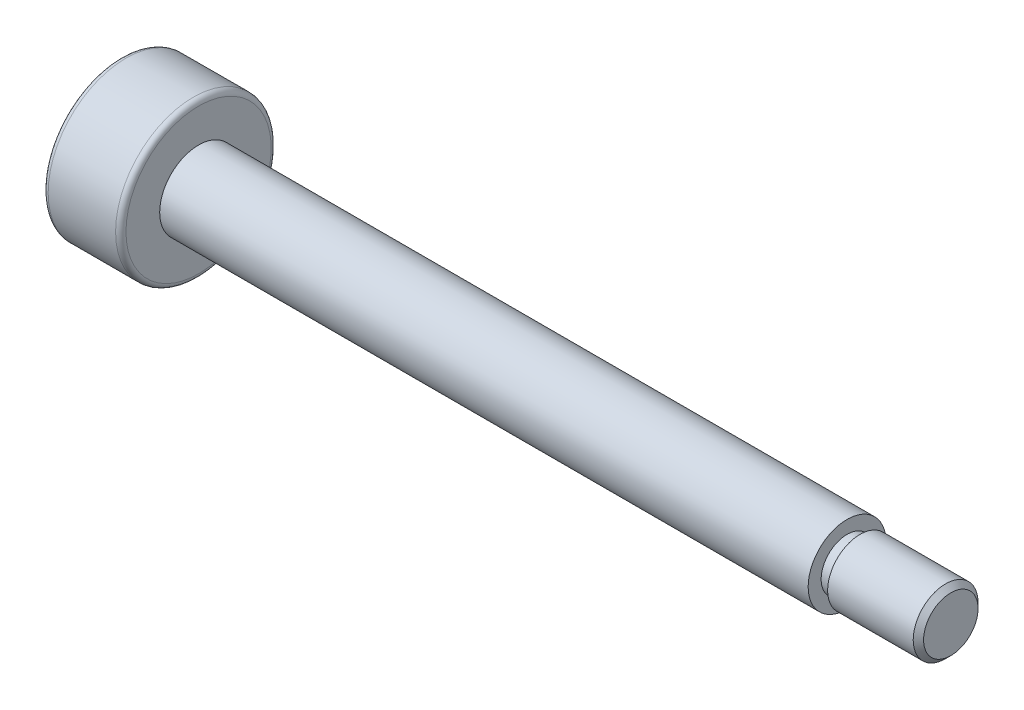
ISO-10303-21;
HEADER;
FILE_DESCRIPTION(('STEP AP214'),'2;1');
FILE_NAME('part.step','',(''),(''),'','','');
FILE_SCHEMA(('AUTOMOTIVE_DESIGN { 1 0 10303 214 1 1 1 1 }'));
ENDSEC;
DATA;
#1=APPLICATION_CONTEXT('core data for automotive mechanical design processes');
#2=APPLICATION_PROTOCOL_DEFINITION('international standard','automotive_design',2000,#1);
#3=PRODUCT_CONTEXT('',#1,'mechanical');
#4=PRODUCT('Part','Part','',(#3));
#5=PRODUCT_RELATED_PRODUCT_CATEGORY('part','',(#4));
#6=PRODUCT_DEFINITION_FORMATION('','',#4);
#7=PRODUCT_DEFINITION_CONTEXT('part definition',#1,'design');
#8=PRODUCT_DEFINITION('design','',#6,#7);
#9=PRODUCT_DEFINITION_SHAPE('','',#8);
#10=(LENGTH_UNIT() NAMED_UNIT(*) SI_UNIT(.MILLI.,.METRE.));
#11=(NAMED_UNIT(*) PLANE_ANGLE_UNIT() SI_UNIT($,.RADIAN.));
#12=(NAMED_UNIT(*) SI_UNIT($,.STERADIAN.) SOLID_ANGLE_UNIT());
#13=UNCERTAINTY_MEASURE_WITH_UNIT(LENGTH_MEASURE(1.E-05),#10,'distance_accuracy_value','');
#14=(GEOMETRIC_REPRESENTATION_CONTEXT(3) GLOBAL_UNCERTAINTY_ASSIGNED_CONTEXT((#13)) GLOBAL_UNIT_ASSIGNED_CONTEXT((#10,
#11,#12)) REPRESENTATION_CONTEXT('',''));
#15=CARTESIAN_POINT('',(0.,0.,0.));
#16=DIRECTION('',(0.,0.,1.));
#17=DIRECTION('',(1.,0.,0.));
#18=AXIS2_PLACEMENT_3D('',#15,#16,#17);
#19=CARTESIAN_POINT('',(-16.,0.,0.));
#20=DIRECTION('',(1.,0.,0.));
#21=DIRECTION('',(0.,0.,-1.));
#22=AXIS2_PLACEMENT_3D('',#19,#20,#21);
#23=PLANE('',#22);
#24=DIRECTION('',(0.,0.866025403784438,-0.5));
#25=VECTOR('',#24,1.);
#26=CARTESIAN_POINT('',(-16.,0.,1.73205080756888));
#27=LINE('',#26,#25);
#28=CARTESIAN_POINT('',(-16.,0.,1.73205080756888));
#29=VERTEX_POINT('',#28);
#30=CARTESIAN_POINT('',(-16.,1.5,0.866025403784438));
#31=VERTEX_POINT('',#30);
#32=EDGE_CURVE('E125',#29,#31,#27,.T.);
#33=ORIENTED_EDGE('',*,*,#32,.F.);
#34=DIRECTION('',(0.,0.866025403784439,0.5));
#35=VECTOR('',#34,1.);
#36=CARTESIAN_POINT('',(-16.,-1.5,0.866025403784438));
#37=LINE('',#36,#35);
#38=CARTESIAN_POINT('',(-16.,-1.5,0.866025403784438));
#39=VERTEX_POINT('',#38);
#40=EDGE_CURVE('E51',#39,#29,#37,.T.);
#41=ORIENTED_EDGE('',*,*,#40,.F.);
#42=DIRECTION('',(0.,0.,1.));
#43=VECTOR('',#42,1.);
#44=CARTESIAN_POINT('',(-16.,-1.5,-0.866025403784438));
#45=LINE('',#44,#43);
#46=CARTESIAN_POINT('',(-16.,-1.5,-0.866025403784438));
#47=VERTEX_POINT('',#46);
#48=EDGE_CURVE('E134',#47,#39,#45,.T.);
#49=ORIENTED_EDGE('',*,*,#48,.F.);
#50=DIRECTION('',(0.,-0.866025403784438,0.5));
#51=VECTOR('',#50,1.);
#52=CARTESIAN_POINT('',(-16.,0.,-1.73205080756888));
#53=LINE('',#52,#51);
#54=CARTESIAN_POINT('',(-16.,0.,-1.73205080756888));
#55=VERTEX_POINT('',#54);
#56=EDGE_CURVE('E132',#55,#47,#53,.T.);
#57=ORIENTED_EDGE('',*,*,#56,.F.);
#58=DIRECTION('',(0.,-0.866025403784439,-0.5));
#59=VECTOR('',#58,1.);
#60=CARTESIAN_POINT('',(-16.,1.5,-0.866025403784438));
#61=LINE('',#60,#59);
#62=CARTESIAN_POINT('',(-16.,1.5,-0.866025403784438));
#63=VERTEX_POINT('',#62);
#64=EDGE_CURVE('E99',#63,#55,#61,.T.);
#65=ORIENTED_EDGE('',*,*,#64,.F.);
#66=DIRECTION('',(0.,0.,-1.));
#67=VECTOR('',#66,1.);
#68=CARTESIAN_POINT('',(-16.,1.5,0.866025403784438));
#69=LINE('',#68,#67);
#70=EDGE_CURVE('E128',#31,#63,#69,.T.);
#71=ORIENTED_EDGE('',*,*,#70,.F.);
#72=EDGE_LOOP('',(#33,#41,#49,#57,#65,#71));
#73=FACE_BOUND('',#72,.T.);
#74=CARTESIAN_POINT('',(-16.,0.,0.));
#75=DIRECTION('',(1.,0.,0.));
#76=DIRECTION('',(0.,0.,-1.));
#77=AXIS2_PLACEMENT_3D('',#74,#75,#76);
#78=CIRCLE('',#77,2.8);
#79=CARTESIAN_POINT('',(-16.,0.,-2.8));
#80=VERTEX_POINT('',#79);
#81=EDGE_CURVE('E167',#80,#80,#78,.F.);
#82=ORIENTED_EDGE('',*,*,#81,.T.);
#83=EDGE_LOOP('',(#82));
#84=FACE_BOUND('',#83,.T.);
#85=ADVANCED_FACE('F35',(#73,#84),#23,.F.);
#86=CARTESIAN_POINT('',(-16.,0.,0.));
#87=DIRECTION('',(-1.,0.,0.));
#88=DIRECTION('',(0.,0.,1.));
#89=AXIS2_PLACEMENT_3D('',#86,#87,#88);
#90=CYLINDRICAL_SURFACE('',#89,3.);
#91=CARTESIAN_POINT('',(-13.2,0.,0.));
#92=DIRECTION('',(-1.,0.,0.));
#93=DIRECTION('',(0.,0.,1.));
#94=AXIS2_PLACEMENT_3D('',#91,#92,#93);
#95=CIRCLE('',#94,3.);
#96=CARTESIAN_POINT('',(-13.2,0.,3.));
#97=VERTEX_POINT('',#96);
#98=EDGE_CURVE('E161',#97,#97,#95,.T.);
#99=ORIENTED_EDGE('',*,*,#98,.T.);
#100=EDGE_LOOP('',(#99));
#101=FACE_BOUND('',#100,.T.);
#102=CARTESIAN_POINT('',(-15.8,0.,0.));
#103=DIRECTION('',(1.,0.,0.));
#104=DIRECTION('',(0.,0.,-1.));
#105=AXIS2_PLACEMENT_3D('',#102,#103,#104);
#106=CIRCLE('',#105,3.);
#107=CARTESIAN_POINT('',(-15.8,0.,-3.));
#108=VERTEX_POINT('',#107);
#109=EDGE_CURVE('E158',#108,#108,#106,.T.);
#110=ORIENTED_EDGE('',*,*,#109,.T.);
#111=EDGE_LOOP('',(#110));
#112=FACE_BOUND('',#111,.T.);
#113=ADVANCED_FACE('F189',(#101,#112),#90,.T.);
#114=CARTESIAN_POINT('',(-13.,3.,0.));
#115=DIRECTION('',(-1.,0.,0.));
#116=DIRECTION('',(0.,0.,1.));
#117=AXIS2_PLACEMENT_3D('',#114,#115,#116);
#118=PLANE('',#117);
#119=CARTESIAN_POINT('',(-13.,0.,0.));
#120=DIRECTION('',(-1.,0.,0.));
#121=DIRECTION('',(0.,0.,1.));
#122=AXIS2_PLACEMENT_3D('',#119,#120,#121);
#123=CIRCLE('',#122,2.8);
#124=CARTESIAN_POINT('',(-13.,0.,2.8));
#125=VERTEX_POINT('',#124);
#126=EDGE_CURVE('E164',#125,#125,#123,.F.);
#127=ORIENTED_EDGE('',*,*,#126,.T.);
#128=EDGE_LOOP('',(#127));
#129=FACE_BOUND('',#128,.T.);
#130=CARTESIAN_POINT('',(-13.,0.,0.));
#131=DIRECTION('',(-1.,0.,0.));
#132=DIRECTION('',(0.,0.,1.));
#133=AXIS2_PLACEMENT_3D('',#130,#131,#132);
#134=CIRCLE('',#133,1.5);
#135=CARTESIAN_POINT('',(-13.,0.,1.5));
#136=VERTEX_POINT('',#135);
#137=EDGE_CURVE('E155',#136,#136,#134,.T.);
#138=ORIENTED_EDGE('',*,*,#137,.T.);
#139=EDGE_LOOP('',(#138));
#140=FACE_BOUND('',#139,.T.);
#141=ADVANCED_FACE('F195',(#129,#140),#118,.F.);
#142=CARTESIAN_POINT('',(-16.,0.,0.));
#143=DIRECTION('',(-1.,0.,0.));
#144=DIRECTION('',(0.,0.,1.));
#145=AXIS2_PLACEMENT_3D('',#142,#143,#144);
#146=CYLINDRICAL_SURFACE('',#145,1.5);
#147=ORIENTED_EDGE('',*,*,#137,.F.);
#148=EDGE_LOOP('',(#147));
#149=FACE_BOUND('',#148,.T.);
#150=CARTESIAN_POINT('',(12.,0.,0.));
#151=DIRECTION('',(-1.,0.,0.));
#152=DIRECTION('',(0.,0.,1.));
#153=AXIS2_PLACEMENT_3D('',#150,#151,#152);
#154=CIRCLE('',#153,1.5);
#155=CARTESIAN_POINT('',(12.,0.,1.5));
#156=VERTEX_POINT('',#155);
#157=EDGE_CURVE('E152',#156,#156,#154,.T.);
#158=ORIENTED_EDGE('',*,*,#157,.T.);
#159=EDGE_LOOP('',(#158));
#160=FACE_BOUND('',#159,.T.);
#161=ADVANCED_FACE('F229',(#149,#160),#146,.T.);
#162=CARTESIAN_POINT('',(12.,1.5,0.));
#163=DIRECTION('',(-1.,0.,0.));
#164=DIRECTION('',(0.,0.,1.));
#165=AXIS2_PLACEMENT_3D('',#162,#163,#164);
#166=PLANE('',#165);
#167=ORIENTED_EDGE('',*,*,#157,.F.);
#168=EDGE_LOOP('',(#167));
#169=FACE_BOUND('',#168,.T.);
#170=CARTESIAN_POINT('',(12.,0.,0.));
#171=DIRECTION('',(-1.,0.,0.));
#172=DIRECTION('',(0.,0.,1.));
#173=AXIS2_PLACEMENT_3D('',#170,#171,#172);
#174=CIRCLE('',#173,1.);
#175=CARTESIAN_POINT('',(12.,0.,1.));
#176=VERTEX_POINT('',#175);
#177=EDGE_CURVE('E149',#176,#176,#174,.T.);
#178=ORIENTED_EDGE('',*,*,#177,.T.);
#179=EDGE_LOOP('',(#178));
#180=FACE_BOUND('',#179,.T.);
#181=ADVANCED_FACE('F205',(#169,#180),#166,.F.);
#182=CARTESIAN_POINT('',(-13.2,0.,0.));
#183=DIRECTION('',(-1.,0.,0.));
#184=DIRECTION('',(0.,0.,1.));
#185=AXIS2_PLACEMENT_3D('',#182,#183,#184);
#186=TOROIDAL_SURFACE('',#185,2.8,0.2);
#187=ORIENTED_EDGE('',*,*,#126,.F.);
#188=EDGE_LOOP('',(#187));
#189=FACE_BOUND('',#188,.T.);
#190=ORIENTED_EDGE('',*,*,#98,.F.);
#191=EDGE_LOOP('',(#190));
#192=FACE_BOUND('',#191,.T.);
#193=ADVANCED_FACE('F202',(#189,#192),#186,.T.);
#194=CARTESIAN_POINT('',(-15.8,0.,0.));
#195=DIRECTION('',(1.,0.,0.));
#196=DIRECTION('',(0.,0.,-1.));
#197=AXIS2_PLACEMENT_3D('',#194,#195,#196);
#198=TOROIDAL_SURFACE('',#197,2.8,0.2);
#199=ORIENTED_EDGE('',*,*,#109,.F.);
#200=EDGE_LOOP('',(#199));
#201=FACE_BOUND('',#200,.T.);
#202=ORIENTED_EDGE('',*,*,#81,.F.);
#203=EDGE_LOOP('',(#202));
#204=FACE_BOUND('',#203,.T.);
#205=ADVANCED_FACE('F204',(#201,#204),#198,.T.);
#206=CARTESIAN_POINT('',(12.,0.,0.));
#207=DIRECTION('',(-1.,0.,0.));
#208=DIRECTION('',(0.,0.,1.));
#209=AXIS2_PLACEMENT_3D('',#206,#207,#208);
#210=CYLINDRICAL_SURFACE('',#209,1.);
#211=CARTESIAN_POINT('',(12.5,0.,0.));
#212=DIRECTION('',(-1.,0.,0.));
#213=DIRECTION('',(0.,0.,1.));
#214=AXIS2_PLACEMENT_3D('',#211,#212,#213);
#215=CIRCLE('',#214,1.);
#216=CARTESIAN_POINT('',(12.5,0.,1.));
#217=VERTEX_POINT('',#216);
#218=EDGE_CURVE('E146',#217,#217,#215,.T.);
#219=ORIENTED_EDGE('',*,*,#218,.T.);
#220=EDGE_LOOP('',(#219));
#221=FACE_BOUND('',#220,.T.);
#222=ORIENTED_EDGE('',*,*,#177,.F.);
#223=EDGE_LOOP('',(#222));
#224=FACE_BOUND('',#223,.T.);
#225=ADVANCED_FACE('F208',(#221,#224),#210,.T.);
#226=CARTESIAN_POINT('',(12.5,1.25,0.));
#227=DIRECTION('',(-1.,0.,0.));
#228=DIRECTION('',(0.,0.,1.));
#229=AXIS2_PLACEMENT_3D('',#226,#227,#228);
#230=PLANE('',#229);
#231=CARTESIAN_POINT('',(12.5,0.,0.));
#232=DIRECTION('',(-1.,0.,0.));
#233=DIRECTION('',(0.,0.,1.));
#234=AXIS2_PLACEMENT_3D('',#231,#232,#233);
#235=CIRCLE('',#234,1.25);
#236=CARTESIAN_POINT('',(12.5,0.,1.25));
#237=VERTEX_POINT('',#236);
#238=EDGE_CURVE('E138',#237,#237,#235,.T.);
#239=ORIENTED_EDGE('',*,*,#238,.T.);
#240=EDGE_LOOP('',(#239));
#241=FACE_BOUND('',#240,.T.);
#242=ORIENTED_EDGE('',*,*,#218,.F.);
#243=EDGE_LOOP('',(#242));
#244=FACE_BOUND('',#243,.T.);
#245=ADVANCED_FACE('F184',(#241,#244),#230,.T.);
#246=CARTESIAN_POINT('',(16.,1.25,0.));
#247=DIRECTION('',(-1.,0.,0.));
#248=DIRECTION('',(0.,0.,1.));
#249=AXIS2_PLACEMENT_3D('',#246,#247,#248);
#250=PLANE('',#249);
#251=CARTESIAN_POINT('',(16.,0.,0.));
#252=DIRECTION('',(-1.,0.,0.));
#253=DIRECTION('',(0.,0.,1.));
#254=AXIS2_PLACEMENT_3D('',#251,#252,#253);
#255=CIRCLE('',#254,1.04999999999999);
#256=CARTESIAN_POINT('',(16.,0.,1.04999999999999));
#257=VERTEX_POINT('',#256);
#258=EDGE_CURVE('E11',#257,#257,#255,.F.);
#259=ORIENTED_EDGE('',*,*,#258,.T.);
#260=EDGE_LOOP('',(#259));
#261=FACE_BOUND('',#260,.T.);
#262=ADVANCED_FACE('F176',(#261),#250,.F.);
#263=CARTESIAN_POINT('',(15.8,0.,0.));
#264=DIRECTION('',(-1.,0.,0.));
#265=DIRECTION('',(0.,0.,1.));
#266=AXIS2_PLACEMENT_3D('',#263,#264,#265);
#267=CONICAL_SURFACE('',#266,1.25,0.785398163397446);
#268=ORIENTED_EDGE('',*,*,#258,.F.);
#269=EDGE_LOOP('',(#268));
#270=FACE_BOUND('',#269,.T.);
#271=CARTESIAN_POINT('',(15.8,0.,0.));
#272=DIRECTION('',(-1.,0.,0.));
#273=DIRECTION('',(0.,0.,1.));
#274=AXIS2_PLACEMENT_3D('',#271,#272,#273);
#275=CIRCLE('',#274,1.25);
#276=CARTESIAN_POINT('',(15.8,0.,1.25));
#277=VERTEX_POINT('',#276);
#278=EDGE_CURVE('E44',#277,#277,#275,.T.);
#279=ORIENTED_EDGE('',*,*,#278,.F.);
#280=EDGE_LOOP('',(#279));
#281=FACE_BOUND('',#280,.T.);
#282=ADVANCED_FACE('F38',(#270,#281),#267,.T.);
#283=CARTESIAN_POINT('',(-16.,0.,0.));
#284=DIRECTION('',(-1.,0.,0.));
#285=DIRECTION('',(0.,0.,1.));
#286=AXIS2_PLACEMENT_3D('',#283,#284,#285);
#287=CYLINDRICAL_SURFACE('',#286,1.25);
#288=ORIENTED_EDGE('',*,*,#278,.T.);
#289=EDGE_LOOP('',(#288));
#290=FACE_BOUND('',#289,.T.);
#291=ORIENTED_EDGE('',*,*,#238,.F.);
#292=EDGE_LOOP('',(#291));
#293=FACE_BOUND('',#292,.T.);
#294=ADVANCED_FACE('F172',(#290,#293),#287,.T.);
#295=CARTESIAN_POINT('',(-14.,-1.5,0.866025403784438));
#296=DIRECTION('',(0.,-0.5,0.866025403784439));
#297=DIRECTION('',(0.,-0.866025403784439,-0.5));
#298=AXIS2_PLACEMENT_3D('',#295,#296,#297);
#299=PLANE('',#298);
#300=ORIENTED_EDGE('',*,*,#40,.T.);
#301=DIRECTION('',(-1.,0.,0.));
#302=VECTOR('',#301,1.);
#303=CARTESIAN_POINT('',(-14.,0.,1.73205080756888));
#304=LINE('',#303,#302);
#305=CARTESIAN_POINT('',(-14.,0.,1.73205080756888));
#306=VERTEX_POINT('',#305);
#307=EDGE_CURVE('E81',#306,#29,#304,.T.);
#308=ORIENTED_EDGE('',*,*,#307,.F.);
#309=DIRECTION('',(0.,0.866025403784439,0.5));
#310=VECTOR('',#309,1.);
#311=CARTESIAN_POINT('',(-14.,-1.5,0.866025403784438));
#312=LINE('',#311,#310);
#313=CARTESIAN_POINT('',(-14.,-1.5,0.866025403784438));
#314=VERTEX_POINT('',#313);
#315=EDGE_CURVE('E136',#314,#306,#312,.T.);
#316=ORIENTED_EDGE('',*,*,#315,.F.);
#317=DIRECTION('',(-1.,0.,0.));
#318=VECTOR('',#317,1.);
#319=CARTESIAN_POINT('',(-14.,-1.5,0.866025403784438));
#320=LINE('',#319,#318);
#321=EDGE_CURVE('E59',#314,#39,#320,.T.);
#322=ORIENTED_EDGE('',*,*,#321,.T.);
#323=EDGE_LOOP('',(#300,#308,#316,#322));
#324=FACE_BOUND('',#323,.T.);
#325=ADVANCED_FACE('F182',(#324),#299,.F.);
#326=CARTESIAN_POINT('',(-14.,-1.5,-0.866025403784438));
#327=DIRECTION('',(0.,-1.,0.));
#328=DIRECTION('',(0.,0.,-1.));
#329=AXIS2_PLACEMENT_3D('',#326,#327,#328);
#330=PLANE('',#329);
#331=ORIENTED_EDGE('',*,*,#48,.T.);
#332=ORIENTED_EDGE('',*,*,#321,.F.);
#333=DIRECTION('',(0.,0.,1.));
#334=VECTOR('',#333,1.);
#335=CARTESIAN_POINT('',(-14.,-1.5,-0.866025403784438));
#336=LINE('',#335,#334);
#337=CARTESIAN_POINT('',(-14.,-1.5,-0.866025403784438));
#338=VERTEX_POINT('',#337);
#339=EDGE_CURVE('E111',#338,#314,#336,.T.);
#340=ORIENTED_EDGE('',*,*,#339,.F.);
#341=DIRECTION('',(-1.,0.,0.));
#342=VECTOR('',#341,1.);
#343=CARTESIAN_POINT('',(-14.,-1.5,-0.866025403784438));
#344=LINE('',#343,#342);
#345=EDGE_CURVE('E103',#338,#47,#344,.T.);
#346=ORIENTED_EDGE('',*,*,#345,.T.);
#347=EDGE_LOOP('',(#331,#332,#340,#346));
#348=FACE_BOUND('',#347,.T.);
#349=ADVANCED_FACE('F303',(#348),#330,.F.);
#350=CARTESIAN_POINT('',(-14.,0.,-1.73205080756888));
#351=DIRECTION('',(0.,-0.5,-0.866025403784438));
#352=DIRECTION('',(0.,0.866025403784439,-0.5));
#353=AXIS2_PLACEMENT_3D('',#350,#351,#352);
#354=PLANE('',#353);
#355=ORIENTED_EDGE('',*,*,#56,.T.);
#356=ORIENTED_EDGE('',*,*,#345,.F.);
#357=DIRECTION('',(0.,-0.866025403784438,0.5));
#358=VECTOR('',#357,1.);
#359=CARTESIAN_POINT('',(-14.,0.,-1.73205080756888));
#360=LINE('',#359,#358);
#361=CARTESIAN_POINT('',(-14.,0.,-1.73205080756888));
#362=VERTEX_POINT('',#361);
#363=EDGE_CURVE('E107',#362,#338,#360,.T.);
#364=ORIENTED_EDGE('',*,*,#363,.F.);
#365=DIRECTION('',(-1.,0.,0.));
#366=VECTOR('',#365,1.);
#367=CARTESIAN_POINT('',(-14.,0.,-1.73205080756888));
#368=LINE('',#367,#366);
#369=EDGE_CURVE('E92',#362,#55,#368,.T.);
#370=ORIENTED_EDGE('',*,*,#369,.T.);
#371=EDGE_LOOP('',(#355,#356,#364,#370));
#372=FACE_BOUND('',#371,.T.);
#373=ADVANCED_FACE('F108',(#372),#354,.F.);
#374=CARTESIAN_POINT('',(-14.,1.5,-0.866025403784438));
#375=DIRECTION('',(0.,0.5,-0.866025403784439));
#376=DIRECTION('',(0.,0.866025403784439,0.5));
#377=AXIS2_PLACEMENT_3D('',#374,#375,#376);
#378=PLANE('',#377);
#379=ORIENTED_EDGE('',*,*,#64,.T.);
#380=ORIENTED_EDGE('',*,*,#369,.F.);
#381=DIRECTION('',(0.,-0.866025403784439,-0.5));
#382=VECTOR('',#381,1.);
#383=CARTESIAN_POINT('',(-14.,1.5,-0.866025403784438));
#384=LINE('',#383,#382);
#385=CARTESIAN_POINT('',(-14.,1.5,-0.866025403784438));
#386=VERTEX_POINT('',#385);
#387=EDGE_CURVE('E96',#386,#362,#384,.T.);
#388=ORIENTED_EDGE('',*,*,#387,.F.);
#389=DIRECTION('',(-1.,0.,0.));
#390=VECTOR('',#389,1.);
#391=CARTESIAN_POINT('',(-14.,1.5,-0.866025403784438));
#392=LINE('',#391,#390);
#393=EDGE_CURVE('E104',#386,#63,#392,.T.);
#394=ORIENTED_EDGE('',*,*,#393,.T.);
#395=EDGE_LOOP('',(#379,#380,#388,#394));
#396=FACE_BOUND('',#395,.T.);
#397=ADVANCED_FACE('F94',(#396),#378,.F.);
#398=CARTESIAN_POINT('',(-14.,1.5,0.866025403784438));
#399=DIRECTION('',(0.,1.,0.));
#400=DIRECTION('',(0.,0.,1.));
#401=AXIS2_PLACEMENT_3D('',#398,#399,#400);
#402=PLANE('',#401);
#403=ORIENTED_EDGE('',*,*,#70,.T.);
#404=ORIENTED_EDGE('',*,*,#393,.F.);
#405=DIRECTION('',(0.,0.,-1.));
#406=VECTOR('',#405,1.);
#407=CARTESIAN_POINT('',(-14.,1.5,0.866025403784438));
#408=LINE('',#407,#406);
#409=CARTESIAN_POINT('',(-14.,1.5,0.866025403784438));
#410=VERTEX_POINT('',#409);
#411=EDGE_CURVE('E117',#410,#386,#408,.T.);
#412=ORIENTED_EDGE('',*,*,#411,.F.);
#413=DIRECTION('',(-1.,0.,0.));
#414=VECTOR('',#413,1.);
#415=CARTESIAN_POINT('',(-14.,1.5,0.866025403784438));
#416=LINE('',#415,#414);
#417=EDGE_CURVE('E141',#410,#31,#416,.T.);
#418=ORIENTED_EDGE('',*,*,#417,.T.);
#419=EDGE_LOOP('',(#403,#404,#412,#418));
#420=FACE_BOUND('',#419,.T.);
#421=ADVANCED_FACE('F324',(#420),#402,.F.);
#422=CARTESIAN_POINT('',(-14.,0.,1.73205080756888));
#423=DIRECTION('',(0.,0.5,0.866025403784438));
#424=DIRECTION('',(0.,-0.866025403784439,0.5));
#425=AXIS2_PLACEMENT_3D('',#422,#423,#424);
#426=PLANE('',#425);
#427=ORIENTED_EDGE('',*,*,#32,.T.);
#428=ORIENTED_EDGE('',*,*,#417,.F.);
#429=DIRECTION('',(0.,0.866025403784438,-0.5));
#430=VECTOR('',#429,1.);
#431=CARTESIAN_POINT('',(-14.,0.,1.73205080756888));
#432=LINE('',#431,#430);
#433=EDGE_CURVE('E119',#306,#410,#432,.T.);
#434=ORIENTED_EDGE('',*,*,#433,.F.);
#435=ORIENTED_EDGE('',*,*,#307,.T.);
#436=EDGE_LOOP('',(#427,#428,#434,#435));
#437=FACE_BOUND('',#436,.T.);
#438=ADVANCED_FACE('F332',(#437),#426,.F.);
#439=CARTESIAN_POINT('',(-14.,0.,0.));
#440=DIRECTION('',(-1.,0.,0.));
#441=DIRECTION('',(0.,0.,1.));
#442=AXIS2_PLACEMENT_3D('',#439,#440,#441);
#443=PLANE('',#442);
#444=ORIENTED_EDGE('',*,*,#315,.T.);
#445=ORIENTED_EDGE('',*,*,#433,.T.);
#446=ORIENTED_EDGE('',*,*,#411,.T.);
#447=ORIENTED_EDGE('',*,*,#387,.T.);
#448=ORIENTED_EDGE('',*,*,#363,.T.);
#449=ORIENTED_EDGE('',*,*,#339,.T.);
#450=EDGE_LOOP('',(#444,#445,#446,#447,#448,#449));
#451=FACE_BOUND('',#450,.T.);
#452=ADVANCED_FACE('F114',(#451),#443,.T.);
#453=CLOSED_SHELL('',(#85,#113,#141,#161,#181,#193,#205,#225,#245,#262,#282,#294,#325,#349,#373,
#397,#421,#438,#452));
#454=MANIFOLD_SOLID_BREP('B2',#453);
#455=ADVANCED_BREP_SHAPE_REPRESENTATION('',(#18,#454),#14);
#456=SHAPE_DEFINITION_REPRESENTATION(#9,#455);
ENDSEC;
END-ISO-10303-21;
